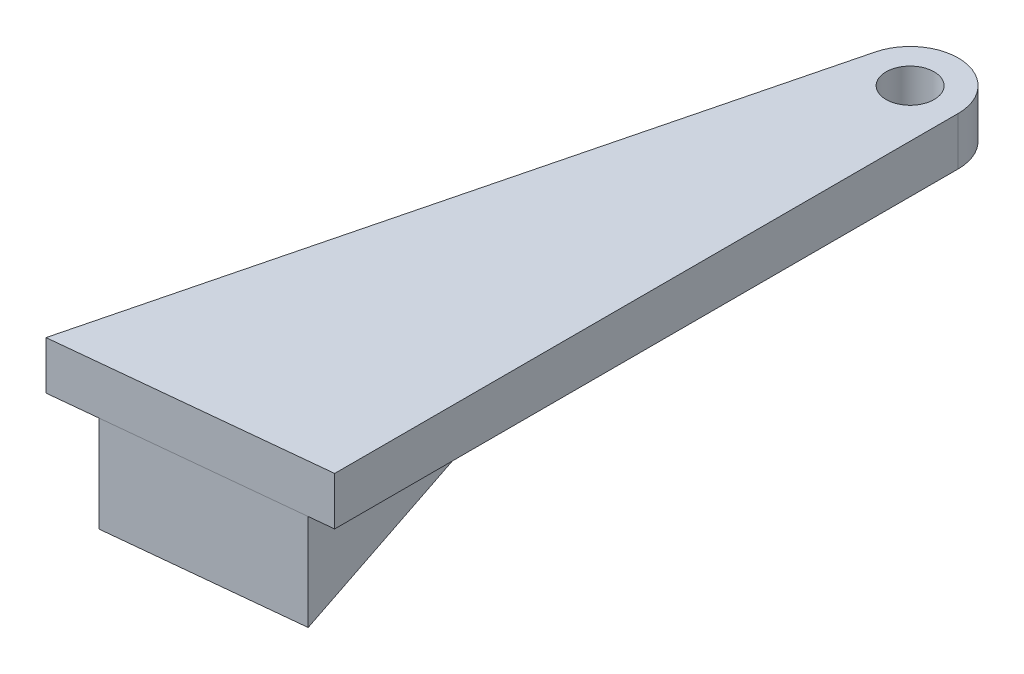
ISO-10303-21;
HEADER;
FILE_DESCRIPTION(('STEP AP214'),'2;1');
FILE_NAME('part.step','',(''),(''),'','','');
FILE_SCHEMA(('AUTOMOTIVE_DESIGN { 1 0 10303 214 1 1 1 1 }'));
ENDSEC;
DATA;
#1=APPLICATION_CONTEXT('core data for automotive mechanical design processes');
#2=APPLICATION_PROTOCOL_DEFINITION('international standard','automotive_design',2000,#1);
#3=PRODUCT_CONTEXT('',#1,'mechanical');
#4=PRODUCT('Part','Part','',(#3));
#5=PRODUCT_RELATED_PRODUCT_CATEGORY('part','',(#4));
#6=PRODUCT_DEFINITION_FORMATION('','',#4);
#7=PRODUCT_DEFINITION_CONTEXT('part definition',#1,'design');
#8=PRODUCT_DEFINITION('design','',#6,#7);
#9=PRODUCT_DEFINITION_SHAPE('','',#8);
#10=(LENGTH_UNIT() NAMED_UNIT(*) SI_UNIT(.MILLI.,.METRE.));
#11=(NAMED_UNIT(*) PLANE_ANGLE_UNIT() SI_UNIT($,.RADIAN.));
#12=(NAMED_UNIT(*) SI_UNIT($,.STERADIAN.) SOLID_ANGLE_UNIT());
#13=UNCERTAINTY_MEASURE_WITH_UNIT(LENGTH_MEASURE(1.E-05),#10,'distance_accuracy_value','');
#14=(GEOMETRIC_REPRESENTATION_CONTEXT(3) GLOBAL_UNCERTAINTY_ASSIGNED_CONTEXT((#13)) GLOBAL_UNIT_ASSIGNED_CONTEXT((#10,
#11,#12)) REPRESENTATION_CONTEXT('',''));
#15=CARTESIAN_POINT('',(0.,0.,0.));
#16=DIRECTION('',(0.,0.,1.));
#17=DIRECTION('',(1.,0.,0.));
#18=AXIS2_PLACEMENT_3D('',#15,#16,#17);
#19=CARTESIAN_POINT('',(-6.28855947882436,0.,-61.7004991917807));
#20=DIRECTION('',(-0.101395443961844,0.,-0.9948462011506));
#21=DIRECTION('',(-0.9948462011506,0.,0.101395443961844));
#22=AXIS2_PLACEMENT_3D('',#19,#20,#21);
#23=PLANE('',#22);
#24=DIRECTION('',(0.9948462011506,0.,-0.101395443961844));
#25=VECTOR('',#24,1.);
#26=CARTESIAN_POINT('',(-562.904605816513,142.5,-4.96978939018319));
#27=LINE('',#26,#25);
#28=CARTESIAN_POINT('',(-574.046912851957,142.5,-3.83415740273492));
#29=VERTEX_POINT('',#28);
#30=CARTESIAN_POINT('',(-563.149519052838,142.5,-4.94482765609744));
#31=VERTEX_POINT('',#30);
#32=EDGE_CURVE('E49',#29,#31,#27,.T.);
#33=ORIENTED_EDGE('',*,*,#32,.T.);
#34=DIRECTION('',(0.,1.,0.));
#35=VECTOR('',#34,1.);
#36=CARTESIAN_POINT('',(-563.149519052838,142.5,-4.94482765609744));
#37=LINE('',#36,#35);
#38=CARTESIAN_POINT('',(-563.149519052838,144.5,-4.94482765609744));
#39=VERTEX_POINT('',#38);
#40=EDGE_CURVE('E115',#31,#39,#37,.T.);
#41=ORIENTED_EDGE('',*,*,#40,.T.);
#42=DIRECTION('',(-0.9948462011506,0.,0.101395443961844));
#43=VECTOR('',#42,1.);
#44=CARTESIAN_POINT('',(-562.904605816513,144.5,-4.96978939018319));
#45=LINE('',#44,#43);
#46=CARTESIAN_POINT('',(-574.046912851957,144.5,-3.83415740273492));
#47=VERTEX_POINT('',#46);
#48=EDGE_CURVE('E104',#39,#47,#45,.T.);
#49=ORIENTED_EDGE('',*,*,#48,.T.);
#50=DIRECTION('',(0.,1.,0.));
#51=VECTOR('',#50,1.);
#52=CARTESIAN_POINT('',(-574.046912851957,142.5,-3.83415740273492));
#53=LINE('',#52,#51);
#54=EDGE_CURVE('E142',#29,#47,#53,.T.);
#55=ORIENTED_EDGE('',*,*,#54,.F.);
#56=EDGE_LOOP('',(#33,#41,#49,#55));
#57=FACE_BOUND('',#56,.T.);
#58=ADVANCED_FACE('F45',(#57),#23,.F.);
#59=CARTESIAN_POINT('',(-564.149519052838,138.5,-4.84294641959378));
#60=CARTESIAN_POINT('',(-566.781983652544,138.5,-4.57464372467234));
#61=CARTESIAN_POINT('',(-569.414448252251,138.5,-4.3063410297509));
#62=CARTESIAN_POINT('',(-572.046912851957,138.5,-4.03803833482946));
#63=CARTESIAN_POINT('',(-564.149519052838,138.833333333333,-5.50961308626045));
#64=CARTESIAN_POINT('',(-566.720183908671,138.833333333333,-5.26366894924913));
#65=CARTESIAN_POINT('',(-569.290848764504,138.833333333333,-5.01772481223781));
#66=CARTESIAN_POINT('',(-571.861513620337,138.833333333333,-4.77178067522649));
#67=CARTESIAN_POINT('',(-564.149519052838,139.5,-6.84294641959378));
#68=CARTESIAN_POINT('',(-566.596584420925,139.5,-6.6417193984027));
#69=CARTESIAN_POINT('',(-569.043649789011,139.5,-6.44049237721163));
#70=CARTESIAN_POINT('',(-571.490715157098,139.5,-6.23926535602055));
#71=CARTESIAN_POINT('',(-564.149519052839,140.5,-8.84294641959379));
#72=CARTESIAN_POINT('',(-566.411185189305,140.5,-8.70879507213306));
#73=CARTESIAN_POINT('',(-568.672851325771,140.5,-8.57464372467233));
#74=CARTESIAN_POINT('',(-570.934517462238,140.5,-8.4404923772116));
#75=CARTESIAN_POINT('',(-564.149519052838,141.5,-10.8429464195938));
#76=CARTESIAN_POINT('',(-566.225785957685,141.5,-10.7758707458634));
#77=CARTESIAN_POINT('',(-568.302052862532,141.5,-10.7087950721331));
#78=CARTESIAN_POINT('',(-570.378319767378,141.5,-10.6417193984027));
#79=CARTESIAN_POINT('',(-564.149519052838,142.166666666667,-12.1762797529271));
#80=CARTESIAN_POINT('',(-566.102186469938,142.166666666667,-12.153921195017));
#81=CARTESIAN_POINT('',(-568.054853887039,142.166666666667,-12.1315626371069));
#82=CARTESIAN_POINT('',(-570.007521304139,142.166666666667,-12.1092040791967));
#83=CARTESIAN_POINT('',(-564.149519052838,142.5,-12.8429464195938));
#84=CARTESIAN_POINT('',(-566.040386726065,142.5,-12.8429464195938));
#85=CARTESIAN_POINT('',(-567.931254399292,142.5,-12.8429464195938));
#86=CARTESIAN_POINT('',(-569.822122072519,142.5,-12.8429464195938));
#87=B_SPLINE_SURFACE_WITH_KNOTS('',3,3,((#59,#60,#61,#62),(#63,#64,#65,#66),(#67,#68,#69,#70),
(#71,#72,#73,#74),(#75,#76,#77,#78),(#79,#80,#81,#82),(#83,#84,#85,#86)),.UNSPECIFIED.,.F.,.F.,
.F.,(4,1,1,1,4),(4,4),(0.,0.10730143771658,0.21460287543316,0.321904313149739,
0.429205750866319),(0.,1.),.UNSPECIFIED.);
#88=DIRECTION('',(0.,-0.447213595499958,0.894427190999916));
#89=VECTOR('',#88,1.);
#90=CARTESIAN_POINT('',(-564.149519052838,142.5,-12.8429464195938));
#91=LINE('',#90,#89);
#92=CARTESIAN_POINT('',(-564.149519052838,142.5,-12.8429464195938));
#93=VERTEX_POINT('',#92);
#94=CARTESIAN_POINT('',(-564.149519052838,138.5,-4.84294641959378));
#95=VERTEX_POINT('',#94);
#96=EDGE_CURVE('E11',#93,#95,#91,.T.);
#97=DIRECTION('',(-0.994846201150599,0.,0.101395443961852));
#98=VECTOR('',#97,1.);
#99=CARTESIAN_POINT('',(-564.149519052838,138.5,-4.84294641959378));
#100=LINE('',#99,#98);
#101=CARTESIAN_POINT('',(-572.046912851957,138.5,-4.03803833482946));
#102=VERTEX_POINT('',#101);
#103=EDGE_CURVE('E156',#95,#102,#100,.T.);
#104=DIRECTION('',(0.224193880826776,0.403083081607191,-0.887277371018714));
#105=VECTOR('',#104,1.);
#106=CARTESIAN_POINT('',(-572.046912851957,138.5,-4.03803833482946));
#107=LINE('',#106,#105);
#108=CARTESIAN_POINT('',(-569.822122072519,142.5,-12.8429464195938));
#109=VERTEX_POINT('',#108);
#110=EDGE_CURVE('E55',#102,#109,#107,.T.);
#111=DIRECTION('',(1.,0.,0.));
#112=VECTOR('',#111,1.);
#113=CARTESIAN_POINT('',(-569.822122072519,142.5,-12.8429464195937));
#114=LINE('',#113,#112);
#115=EDGE_CURVE('E133',#109,#93,#114,.T.);
#116=ORIENTED_EDGE('',*,*,#96,.T.);
#117=ORIENTED_EDGE('',*,*,#103,.T.);
#118=ORIENTED_EDGE('',*,*,#110,.T.);
#119=ORIENTED_EDGE('',*,*,#115,.T.);
#120=EDGE_LOOP('',(#116,#117,#118,#119));
#121=FACE_BOUND('',#120,.T.);
#122=ADVANCED_FACE('F204',(#121),#87,.F.);
#123=CARTESIAN_POINT('',(-564.149519052838,138.5,-12.8429464195938));
#124=DIRECTION('',(-1.,0.,0.));
#125=DIRECTION('',(0.,0.,1.));
#126=AXIS2_PLACEMENT_3D('',#123,#124,#125);
#127=PLANE('',#126);
#128=ORIENTED_EDGE('',*,*,#96,.F.);
#129=DIRECTION('',(0.,0.,1.));
#130=VECTOR('',#129,1.);
#131=CARTESIAN_POINT('',(-564.149519052838,142.5,-12.8429464195938));
#132=LINE('',#131,#130);
#133=CARTESIAN_POINT('',(-564.149519052838,142.5,-4.84294641959379));
#134=VERTEX_POINT('',#133);
#135=EDGE_CURVE('E157',#93,#134,#132,.T.);
#136=ORIENTED_EDGE('',*,*,#135,.T.);
#137=DIRECTION('',(0.,1.,0.));
#138=VECTOR('',#137,1.);
#139=CARTESIAN_POINT('',(-564.149519052838,138.5,-4.84294641959378));
#140=LINE('',#139,#138);
#141=EDGE_CURVE('E240',#95,#134,#140,.T.);
#142=ORIENTED_EDGE('',*,*,#141,.F.);
#143=EDGE_LOOP('',(#128,#136,#142));
#144=FACE_BOUND('',#143,.T.);
#145=ADVANCED_FACE('F209',(#144),#127,.F.);
#146=CARTESIAN_POINT('',(-564.149519052838,138.5,-4.84294641959378));
#147=DIRECTION('',(-0.101395443961852,0.,-0.9948462011506));
#148=DIRECTION('',(-0.994846201150599,0.,0.101395443961852));
#149=AXIS2_PLACEMENT_3D('',#146,#147,#148);
#150=PLANE('',#149);
#151=DIRECTION('',(-0.994846201150599,0.,0.101395443961852));
#152=VECTOR('',#151,1.);
#153=CARTESIAN_POINT('',(-564.149519052838,142.5,-4.84294641959378));
#154=LINE('',#153,#152);
#155=CARTESIAN_POINT('',(-572.046912851957,142.5,-4.03803833482945));
#156=VERTEX_POINT('',#155);
#157=EDGE_CURVE('E153',#134,#156,#154,.T.);
#158=ORIENTED_EDGE('',*,*,#157,.T.);
#159=DIRECTION('',(0.,1.,0.));
#160=VECTOR('',#159,1.);
#161=CARTESIAN_POINT('',(-572.046912851957,138.5,-4.03803833482945));
#162=LINE('',#161,#160);
#163=EDGE_CURVE('E164',#102,#156,#162,.T.);
#164=ORIENTED_EDGE('',*,*,#163,.F.);
#165=ORIENTED_EDGE('',*,*,#103,.F.);
#166=ORIENTED_EDGE('',*,*,#141,.T.);
#167=EDGE_LOOP('',(#158,#164,#165,#166));
#168=FACE_BOUND('',#167,.T.);
#169=ADVANCED_FACE('F223',(#168),#150,.F.);
#170=CARTESIAN_POINT('',(-569.822122072519,138.5,-12.8429464195937));
#171=DIRECTION('',(0.969528918314512,0.,0.24497688983227));
#172=DIRECTION('',(0.24497688983227,0.,-0.969528918314512));
#173=AXIS2_PLACEMENT_3D('',#170,#171,#172);
#174=PLANE('',#173);
#175=ORIENTED_EDGE('',*,*,#110,.F.);
#176=ORIENTED_EDGE('',*,*,#163,.T.);
#177=DIRECTION('',(0.24497688983227,0.,-0.969528918314512));
#178=VECTOR('',#177,1.);
#179=CARTESIAN_POINT('',(-569.822122072519,142.5,-12.8429464195937));
#180=LINE('',#179,#178);
#181=EDGE_CURVE('E127',#156,#109,#180,.T.);
#182=ORIENTED_EDGE('',*,*,#181,.T.);
#183=EDGE_LOOP('',(#175,#176,#182));
#184=FACE_BOUND('',#183,.T.);
#185=ADVANCED_FACE('F213',(#184),#174,.F.);
#186=CARTESIAN_POINT('',(-565.149519052838,142.5,-30.8827520290063));
#187=DIRECTION('',(0.,1.,0.));
#188=DIRECTION('',(0.,0.,1.));
#189=AXIS2_PLACEMENT_3D('',#186,#187,#188);
#190=CYLINDRICAL_SURFACE('',#189,1.00000000000005);
#191=CARTESIAN_POINT('',(-565.149519052838,142.5,-30.8827520290063));
#192=DIRECTION('',(0.,1.,0.));
#193=DIRECTION('',(0.,0.,1.));
#194=AXIS2_PLACEMENT_3D('',#191,#192,#193);
#195=CIRCLE('',#194,1.00000000000005);
#196=CARTESIAN_POINT('',(-565.149519052838,142.5,-29.8827520290062));
#197=VERTEX_POINT('',#196);
#198=EDGE_CURVE('E152',#197,#197,#195,.T.);
#199=ORIENTED_EDGE('',*,*,#198,.F.);
#200=EDGE_LOOP('',(#199));
#201=FACE_BOUND('',#200,.T.);
#202=CARTESIAN_POINT('',(-565.149519052838,144.5,-30.8827520290063));
#203=DIRECTION('',(0.,1.,0.));
#204=DIRECTION('',(0.,0.,1.));
#205=AXIS2_PLACEMENT_3D('',#202,#203,#204);
#206=CIRCLE('',#205,1.00000000000005);
#207=CARTESIAN_POINT('',(-565.149519052838,144.5,-29.8827520290062));
#208=VERTEX_POINT('',#207);
#209=EDGE_CURVE('E114',#208,#208,#206,.T.);
#210=ORIENTED_EDGE('',*,*,#209,.T.);
#211=EDGE_LOOP('',(#210));
#212=FACE_BOUND('',#211,.T.);
#213=ADVANCED_FACE('F211',(#201,#212),#190,.F.);
#214=CARTESIAN_POINT('',(-565.149519052838,142.5,-30.8827520290063));
#215=DIRECTION('',(0.,1.,0.));
#216=DIRECTION('',(0.,0.,1.));
#217=AXIS2_PLACEMENT_3D('',#214,#215,#216);
#218=CYLINDRICAL_SURFACE('',#217,1.99999999999991);
#219=CARTESIAN_POINT('',(-565.149519052838,144.5,-30.8827520290063));
#220=DIRECTION('',(0.,1.,0.));
#221=DIRECTION('',(0.,0.,1.));
#222=AXIS2_PLACEMENT_3D('',#219,#220,#221);
#223=CIRCLE('',#222,1.99999999999991);
#224=CARTESIAN_POINT('',(-563.149519052838,144.5,-30.8827520290063));
#225=VERTEX_POINT('',#224);
#226=CARTESIAN_POINT('',(-567.088576889467,144.5,-31.3727058086708));
#227=VERTEX_POINT('',#226);
#228=EDGE_CURVE('E128',#225,#227,#223,.T.);
#229=ORIENTED_EDGE('',*,*,#228,.F.);
#230=DIRECTION('',(0.,1.,0.));
#231=VECTOR('',#230,1.);
#232=CARTESIAN_POINT('',(-563.149519052838,142.5,-30.8827520290063));
#233=LINE('',#232,#231);
#234=CARTESIAN_POINT('',(-563.149519052838,142.5,-30.8827520290063));
#235=VERTEX_POINT('',#234);
#236=EDGE_CURVE('E124',#235,#225,#233,.T.);
#237=ORIENTED_EDGE('',*,*,#236,.F.);
#238=CARTESIAN_POINT('',(-565.149519052838,142.5,-30.8827520290063));
#239=DIRECTION('',(0.,1.,0.));
#240=DIRECTION('',(0.,0.,1.));
#241=AXIS2_PLACEMENT_3D('',#238,#239,#240);
#242=CIRCLE('',#241,1.99999999999991);
#243=CARTESIAN_POINT('',(-567.088576889467,142.5,-31.3727058086708));
#244=VERTEX_POINT('',#243);
#245=EDGE_CURVE('E145',#235,#244,#242,.T.);
#246=ORIENTED_EDGE('',*,*,#245,.T.);
#247=DIRECTION('',(0.,1.,0.));
#248=VECTOR('',#247,1.);
#249=CARTESIAN_POINT('',(-567.088576889467,142.5,-31.3727058086708));
#250=LINE('',#249,#248);
#251=EDGE_CURVE('E146',#244,#227,#250,.T.);
#252=ORIENTED_EDGE('',*,*,#251,.T.);
#253=EDGE_LOOP('',(#229,#237,#246,#252));
#254=FACE_BOUND('',#253,.T.);
#255=ADVANCED_FACE('F186',(#254),#218,.T.);
#256=CARTESIAN_POINT('',(-565.149519052838,142.5,-30.8827520290063));
#257=DIRECTION('',(0.,1.,0.));
#258=DIRECTION('',(0.,0.,1.));
#259=AXIS2_PLACEMENT_3D('',#256,#257,#258);
#260=PLANE('',#259);
#261=ORIENTED_EDGE('',*,*,#32,.F.);
#262=DIRECTION('',(-0.244976889832272,0.,0.969528918314512));
#263=VECTOR('',#262,1.);
#264=CARTESIAN_POINT('',(-574.027091748517,142.5,-3.9126020796645));
#265=LINE('',#264,#263);
#266=EDGE_CURVE('E137',#244,#29,#265,.T.);
#267=ORIENTED_EDGE('',*,*,#266,.F.);
#268=ORIENTED_EDGE('',*,*,#245,.F.);
#269=DIRECTION('',(0.,0.,-1.));
#270=VECTOR('',#269,1.);
#271=CARTESIAN_POINT('',(-563.149519052838,142.5,-0.999980256818761));
#272=LINE('',#271,#270);
#273=EDGE_CURVE('E149',#31,#235,#272,.T.);
#274=ORIENTED_EDGE('',*,*,#273,.F.);
#275=EDGE_LOOP('',(#261,#267,#268,#274));
#276=FACE_BOUND('',#275,.T.);
#277=ORIENTED_EDGE('',*,*,#198,.T.);
#278=EDGE_LOOP('',(#277));
#279=FACE_BOUND('',#278,.T.);
#280=ORIENTED_EDGE('',*,*,#181,.F.);
#281=ORIENTED_EDGE('',*,*,#157,.F.);
#282=ORIENTED_EDGE('',*,*,#135,.F.);
#283=ORIENTED_EDGE('',*,*,#115,.F.);
#284=EDGE_LOOP('',(#280,#281,#282,#283));
#285=FACE_BOUND('',#284,.T.);
#286=ADVANCED_FACE('F189',(#276,#279,#285),#260,.F.);
#287=CARTESIAN_POINT('',(-562.5,144.5,-0.999980256818761));
#288=DIRECTION('',(0.,1.,0.));
#289=DIRECTION('',(0.,0.,1.));
#290=AXIS2_PLACEMENT_3D('',#287,#288,#289);
#291=PLANE('',#290);
#292=ORIENTED_EDGE('',*,*,#48,.F.);
#293=DIRECTION('',(0.,0.,-1.));
#294=VECTOR('',#293,1.);
#295=CARTESIAN_POINT('',(-563.149519052838,144.5,-0.999980256818761));
#296=LINE('',#295,#294);
#297=EDGE_CURVE('E109',#39,#225,#296,.T.);
#298=ORIENTED_EDGE('',*,*,#297,.T.);
#299=ORIENTED_EDGE('',*,*,#228,.T.);
#300=DIRECTION('',(-0.244976889832272,0.,0.969528918314512));
#301=VECTOR('',#300,1.);
#302=CARTESIAN_POINT('',(-574.027091748517,144.5,-3.9126020796645));
#303=LINE('',#302,#301);
#304=EDGE_CURVE('E111',#227,#47,#303,.T.);
#305=ORIENTED_EDGE('',*,*,#304,.T.);
#306=EDGE_LOOP('',(#292,#298,#299,#305));
#307=FACE_BOUND('',#306,.T.);
#308=ORIENTED_EDGE('',*,*,#209,.F.);
#309=EDGE_LOOP('',(#308));
#310=FACE_BOUND('',#309,.T.);
#311=ADVANCED_FACE('F47',(#307,#310),#291,.T.);
#312=CARTESIAN_POINT('',(-563.149519052838,142.5,-0.999980256818761));
#313=DIRECTION('',(1.,0.,0.));
#314=DIRECTION('',(0.,0.,-1.));
#315=AXIS2_PLACEMENT_3D('',#312,#313,#314);
#316=PLANE('',#315);
#317=ORIENTED_EDGE('',*,*,#297,.F.);
#318=ORIENTED_EDGE('',*,*,#40,.F.);
#319=ORIENTED_EDGE('',*,*,#273,.T.);
#320=ORIENTED_EDGE('',*,*,#236,.T.);
#321=EDGE_LOOP('',(#317,#318,#319,#320));
#322=FACE_BOUND('',#321,.T.);
#323=ADVANCED_FACE('F123',(#322),#316,.T.);
#324=CARTESIAN_POINT('',(-574.027091748517,142.5,-3.9126020796645));
#325=DIRECTION('',(-0.969528918314512,0.,-0.244976889832272));
#326=DIRECTION('',(-0.244976889832272,0.,0.969528918314512));
#327=AXIS2_PLACEMENT_3D('',#324,#325,#326);
#328=PLANE('',#327);
#329=ORIENTED_EDGE('',*,*,#304,.F.);
#330=ORIENTED_EDGE('',*,*,#251,.F.);
#331=ORIENTED_EDGE('',*,*,#266,.T.);
#332=ORIENTED_EDGE('',*,*,#54,.T.);
#333=EDGE_LOOP('',(#329,#330,#331,#332));
#334=FACE_BOUND('',#333,.T.);
#335=ADVANCED_FACE('F194',(#334),#328,.T.);
#336=CLOSED_SHELL('',(#58,#122,#145,#169,#185,#213,#255,#286,#311,#323,#335));
#337=MANIFOLD_SOLID_BREP('B2',#336);
#338=ADVANCED_BREP_SHAPE_REPRESENTATION('',(#18,#337),#14);
#339=SHAPE_DEFINITION_REPRESENTATION(#9,#338);
ENDSEC;
END-ISO-10303-21;
